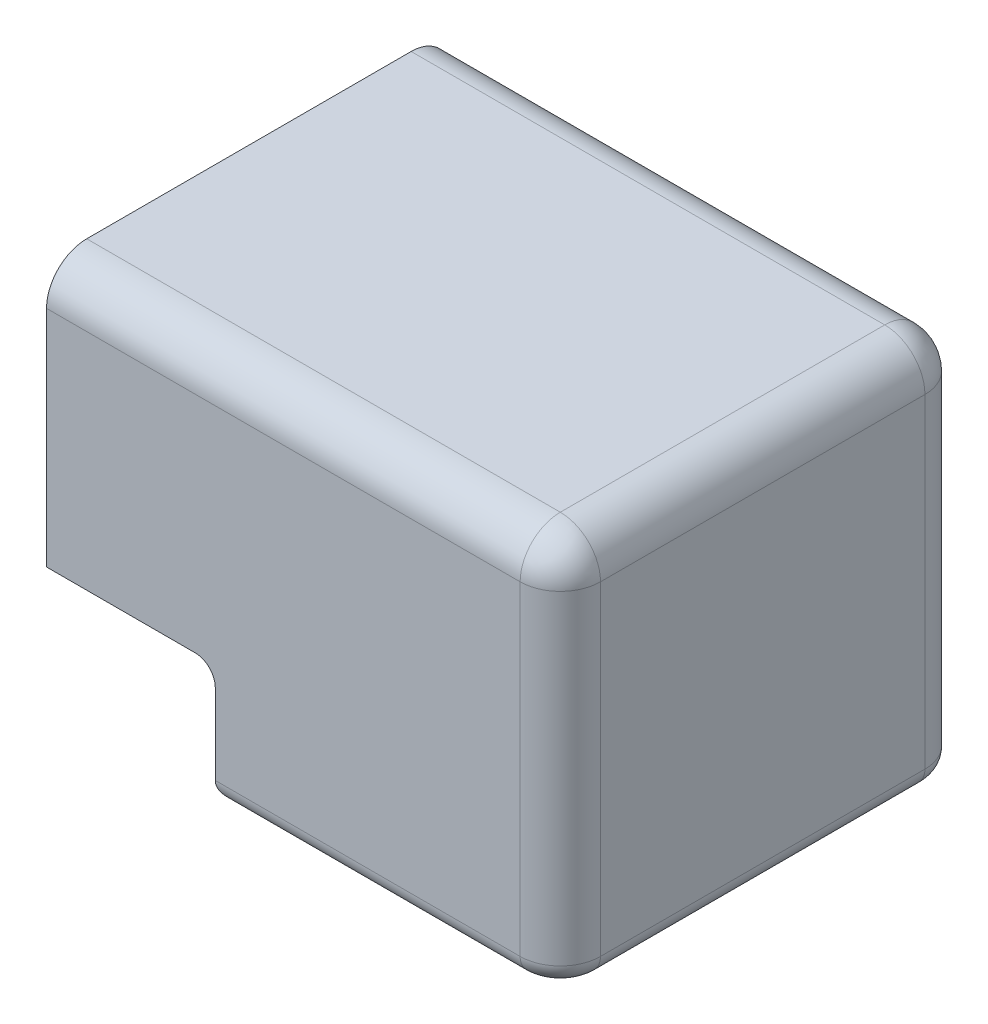
ISO-10303-21;
HEADER;
FILE_DESCRIPTION(('STEP AP214'),'2;1');
FILE_NAME('part.step','',(''),(''),'','','');
FILE_SCHEMA(('AUTOMOTIVE_DESIGN { 1 0 10303 214 1 1 1 1 }'));
ENDSEC;
DATA;
#1=APPLICATION_CONTEXT('core data for automotive mechanical design processes');
#2=APPLICATION_PROTOCOL_DEFINITION('international standard','automotive_design',2000,#1);
#3=PRODUCT_CONTEXT('',#1,'mechanical');
#4=PRODUCT('Part','Part','',(#3));
#5=PRODUCT_RELATED_PRODUCT_CATEGORY('part','',(#4));
#6=PRODUCT_DEFINITION_FORMATION('','',#4);
#7=PRODUCT_DEFINITION_CONTEXT('part definition',#1,'design');
#8=PRODUCT_DEFINITION('design','',#6,#7);
#9=PRODUCT_DEFINITION_SHAPE('','',#8);
#10=(LENGTH_UNIT() NAMED_UNIT(*) SI_UNIT(.MILLI.,.METRE.));
#11=(NAMED_UNIT(*) PLANE_ANGLE_UNIT() SI_UNIT($,.RADIAN.));
#12=(NAMED_UNIT(*) SI_UNIT($,.STERADIAN.) SOLID_ANGLE_UNIT());
#13=UNCERTAINTY_MEASURE_WITH_UNIT(LENGTH_MEASURE(1.E-05),#10,'distance_accuracy_value','');
#14=(GEOMETRIC_REPRESENTATION_CONTEXT(3) GLOBAL_UNCERTAINTY_ASSIGNED_CONTEXT((#13)) GLOBAL_UNIT_ASSIGNED_CONTEXT((#10,
#11,#12)) REPRESENTATION_CONTEXT('',''));
#15=CARTESIAN_POINT('',(0.,0.,0.));
#16=DIRECTION('',(0.,0.,1.));
#17=DIRECTION('',(1.,0.,0.));
#18=AXIS2_PLACEMENT_3D('',#15,#16,#17);
#19=CARTESIAN_POINT('',(76.2,-20.8749999999833,0.));
#20=DIRECTION('',(0.,1.,0.));
#21=DIRECTION('',(0.,0.,1.));
#22=AXIS2_PLACEMENT_3D('',#19,#20,#21);
#23=PLANE('',#22);
#24=DIRECTION('',(-1.,0.,0.));
#25=VECTOR('',#24,1.);
#26=CARTESIAN_POINT('',(76.2,-20.8749999999833,-138.842163617286));
#27=LINE('',#26,#25);
#28=CARTESIAN_POINT('',(23.495,-20.8749999999833,-138.842163617286));
#29=VERTEX_POINT('',#28);
#30=CARTESIAN_POINT('',(0.,-20.8749999999833,-138.842163617286));
#31=VERTEX_POINT('',#30);
#32=EDGE_CURVE('E256',#29,#31,#27,.T.);
#33=ORIENTED_EDGE('',*,*,#32,.F.);
#34=DIRECTION('',(0.,0.,1.));
#35=VECTOR('',#34,1.);
#36=CARTESIAN_POINT('',(23.495,-20.8749999999833,0.));
#37=LINE('',#36,#35);
#38=CARTESIAN_POINT('',(23.495,-20.8749999999833,-74.8671636172858));
#39=VERTEX_POINT('',#38);
#40=EDGE_CURVE('E311',#29,#39,#37,.T.);
#41=ORIENTED_EDGE('',*,*,#40,.T.);
#42=DIRECTION('',(-1.,0.,0.));
#43=VECTOR('',#42,1.);
#44=CARTESIAN_POINT('',(76.2,-20.8749999999833,-74.8671636172858));
#45=LINE('',#44,#43);
#46=CARTESIAN_POINT('',(0.,-20.8749999999833,-74.8671636172858));
#47=VERTEX_POINT('',#46);
#48=EDGE_CURVE('E259',#39,#47,#45,.T.);
#49=ORIENTED_EDGE('',*,*,#48,.T.);
#50=DIRECTION('',(0.,0.,-1.));
#51=VECTOR('',#50,1.);
#52=CARTESIAN_POINT('',(0.,-20.8749999999833,0.));
#53=LINE('',#52,#51);
#54=EDGE_CURVE('E255',#47,#31,#53,.T.);
#55=ORIENTED_EDGE('',*,*,#54,.T.);
#56=EDGE_LOOP('',(#33,#41,#49,#55));
#57=FACE_BOUND('',#56,.T.);
#58=ADVANCED_FACE('F40',(#57),#23,.F.);
#59=CARTESIAN_POINT('',(76.2,0.,-138.842163617286));
#60=DIRECTION('',(0.,0.,1.));
#61=DIRECTION('',(1.,0.,0.));
#62=AXIS2_PLACEMENT_3D('',#59,#60,#61);
#63=PLANE('',#62);
#64=DIRECTION('',(0.,1.,0.));
#65=VECTOR('',#64,1.);
#66=CARTESIAN_POINT('',(74.85,-20.8749999999833,-138.842163617286));
#67=LINE('',#66,#65);
#68=CARTESIAN_POINT('',(74.85,14.5250000000167,-138.842163617286));
#69=VERTEX_POINT('',#68);
#70=CARTESIAN_POINT('',(74.85,-36.7499999999833,-138.842163617286));
#71=VERTEX_POINT('',#70);
#72=EDGE_CURVE('E295',#69,#71,#67,.F.);
#73=ORIENTED_EDGE('',*,*,#72,.T.);
#74=DIRECTION('',(1.,0.,0.));
#75=VECTOR('',#74,1.);
#76=CARTESIAN_POINT('',(26.67,-36.7499999999833,-138.842163617286));
#77=LINE('',#76,#75);
#78=CARTESIAN_POINT('',(26.67,-36.7499999999833,-138.842163617286));
#79=VERTEX_POINT('',#78);
#80=EDGE_CURVE('E349',#71,#79,#77,.F.);
#81=ORIENTED_EDGE('',*,*,#80,.T.);
#82=DIRECTION('',(0.,1.,0.));
#83=VECTOR('',#82,1.);
#84=CARTESIAN_POINT('',(26.67,-39.9249999999833,-138.842163617286));
#85=LINE('',#84,#83);
#86=CARTESIAN_POINT('',(26.67,-24.0499999999833,-138.842163617286));
#87=VERTEX_POINT('',#86);
#88=EDGE_CURVE('E220',#79,#87,#85,.T.);
#89=ORIENTED_EDGE('',*,*,#88,.T.);
#90=CARTESIAN_POINT('',(23.495,-24.0499999999833,-138.842163617286));
#91=DIRECTION('',(0.,0.,1.));
#92=DIRECTION('',(1.,0.,0.));
#93=AXIS2_PLACEMENT_3D('',#90,#91,#92);
#94=CIRCLE('',#93,3.175);
#95=EDGE_CURVE('E334',#87,#29,#94,.T.);
#96=ORIENTED_EDGE('',*,*,#95,.T.);
#97=ORIENTED_EDGE('',*,*,#32,.T.);
#98=DIRECTION('',(0.,1.,0.));
#99=VECTOR('',#98,1.);
#100=CARTESIAN_POINT('',(0.,0.,-138.842163617286));
#101=LINE('',#100,#99);
#102=CARTESIAN_POINT('',(0.,14.5250000000167,-138.842163617286));
#103=VERTEX_POINT('',#102);
#104=EDGE_CURVE('E264',#31,#103,#101,.T.);
#105=ORIENTED_EDGE('',*,*,#104,.T.);
#106=DIRECTION('',(-1.,0.,0.));
#107=VECTOR('',#106,1.);
#108=CARTESIAN_POINT('',(81.2,14.5250000000167,-138.842163617286));
#109=LINE('',#108,#107);
#110=EDGE_CURVE('E293',#103,#69,#109,.F.);
#111=ORIENTED_EDGE('',*,*,#110,.T.);
#112=EDGE_LOOP('',(#73,#81,#89,#96,#97,#105,#111));
#113=FACE_BOUND('',#112,.T.);
#114=ADVANCED_FACE('F421',(#113),#63,.F.);
#115=CARTESIAN_POINT('',(76.2,20.8750000000167,0.));
#116=DIRECTION('',(0.,1.,0.));
#117=DIRECTION('',(0.,0.,1.));
#118=AXIS2_PLACEMENT_3D('',#115,#116,#117);
#119=PLANE('',#118);
#120=DIRECTION('',(0.,0.,-1.));
#121=VECTOR('',#120,1.);
#122=CARTESIAN_POINT('',(74.85,20.8750000000167,0.));
#123=LINE('',#122,#121);
#124=CARTESIAN_POINT('',(74.85,20.8750000000167,-81.2171636172858));
#125=VERTEX_POINT('',#124);
#126=CARTESIAN_POINT('',(74.85,20.8750000000167,-132.492163617286));
#127=VERTEX_POINT('',#126);
#128=EDGE_CURVE('E304',#125,#127,#123,.T.);
#129=ORIENTED_EDGE('',*,*,#128,.T.);
#130=DIRECTION('',(-1.,0.,0.));
#131=VECTOR('',#130,1.);
#132=CARTESIAN_POINT('',(0.,20.8750000000167,-132.492163617286));
#133=LINE('',#132,#131);
#134=CARTESIAN_POINT('',(0.,20.8750000000167,-132.492163617286));
#135=VERTEX_POINT('',#134);
#136=EDGE_CURVE('E306',#127,#135,#133,.T.);
#137=ORIENTED_EDGE('',*,*,#136,.T.);
#138=DIRECTION('',(0.,0.,-1.));
#139=VECTOR('',#138,1.);
#140=CARTESIAN_POINT('',(0.,20.8750000000167,0.));
#141=LINE('',#140,#139);
#142=CARTESIAN_POINT('',(0.,20.8750000000167,-81.2171636172858));
#143=VERTEX_POINT('',#142);
#144=EDGE_CURVE('E267',#143,#135,#141,.T.);
#145=ORIENTED_EDGE('',*,*,#144,.F.);
#146=DIRECTION('',(-1.,0.,0.));
#147=VECTOR('',#146,1.);
#148=CARTESIAN_POINT('',(76.2,20.8750000000167,-81.2171636172858));
#149=LINE('',#148,#147);
#150=EDGE_CURVE('E302',#143,#125,#149,.F.);
#151=ORIENTED_EDGE('',*,*,#150,.T.);
#152=EDGE_LOOP('',(#129,#137,#145,#151));
#153=FACE_BOUND('',#152,.T.);
#154=ADVANCED_FACE('F452',(#153),#119,.T.);
#155=CARTESIAN_POINT('',(76.2,0.,-74.8671636172858));
#156=DIRECTION('',(0.,0.,1.));
#157=DIRECTION('',(1.,0.,0.));
#158=AXIS2_PLACEMENT_3D('',#155,#156,#157);
#159=PLANE('',#158);
#160=DIRECTION('',(0.,1.,0.));
#161=VECTOR('',#160,1.);
#162=CARTESIAN_POINT('',(26.67,-39.9249999999833,-74.8671636172858));
#163=LINE('',#162,#161);
#164=CARTESIAN_POINT('',(26.67,-36.7499999999833,-74.8671636172858));
#165=VERTEX_POINT('',#164);
#166=CARTESIAN_POINT('',(26.67,-24.0499999999833,-74.8671636172858));
#167=VERTEX_POINT('',#166);
#168=EDGE_CURVE('E224',#165,#167,#163,.T.);
#169=ORIENTED_EDGE('',*,*,#168,.F.);
#170=DIRECTION('',(-1.,0.,0.));
#171=VECTOR('',#170,1.);
#172=CARTESIAN_POINT('',(76.2,-36.7499999999833,-74.8671636172858));
#173=LINE('',#172,#171);
#174=CARTESIAN_POINT('',(74.85,-36.7499999999833,-74.8671636172858));
#175=VERTEX_POINT('',#174);
#176=EDGE_CURVE('E11',#165,#175,#173,.F.);
#177=ORIENTED_EDGE('',*,*,#176,.T.);
#178=DIRECTION('',(0.,1.,0.));
#179=VECTOR('',#178,1.);
#180=CARTESIAN_POINT('',(74.85,0.,-74.8671636172858));
#181=LINE('',#180,#179);
#182=CARTESIAN_POINT('',(74.85,14.5250000000167,-74.8671636172858));
#183=VERTEX_POINT('',#182);
#184=EDGE_CURVE('E300',#175,#183,#181,.T.);
#185=ORIENTED_EDGE('',*,*,#184,.T.);
#186=DIRECTION('',(-1.,0.,0.));
#187=VECTOR('',#186,1.);
#188=CARTESIAN_POINT('',(76.2,14.5250000000167,-74.8671636172858));
#189=LINE('',#188,#187);
#190=CARTESIAN_POINT('',(0.,14.5250000000167,-74.8671636172858));
#191=VERTEX_POINT('',#190);
#192=EDGE_CURVE('E298',#183,#191,#189,.T.);
#193=ORIENTED_EDGE('',*,*,#192,.T.);
#194=DIRECTION('',(0.,1.,0.));
#195=VECTOR('',#194,1.);
#196=CARTESIAN_POINT('',(0.,0.,-74.8671636172858));
#197=LINE('',#196,#195);
#198=EDGE_CURVE('E261',#47,#191,#197,.T.);
#199=ORIENTED_EDGE('',*,*,#198,.F.);
#200=ORIENTED_EDGE('',*,*,#48,.F.);
#201=CARTESIAN_POINT('',(23.495,-24.0499999999833,-74.8671636172858));
#202=DIRECTION('',(0.,0.,1.));
#203=DIRECTION('',(1.,0.,0.));
#204=AXIS2_PLACEMENT_3D('',#201,#202,#203);
#205=CIRCLE('',#204,3.175);
#206=EDGE_CURVE('E331',#39,#167,#205,.F.);
#207=ORIENTED_EDGE('',*,*,#206,.T.);
#208=EDGE_LOOP('',(#169,#177,#185,#193,#199,#200,#207));
#209=FACE_BOUND('',#208,.T.);
#210=ADVANCED_FACE('F405',(#209),#159,.T.);
#211=CARTESIAN_POINT('',(81.2,0.,0.));
#212=DIRECTION('',(1.,0.,0.));
#213=DIRECTION('',(0.,0.,-1.));
#214=AXIS2_PLACEMENT_3D('',#211,#212,#213);
#215=PLANE('',#214);
#216=DIRECTION('',(0.,1.,0.));
#217=VECTOR('',#216,1.);
#218=CARTESIAN_POINT('',(81.2,0.,-81.2171636172858));
#219=LINE('',#218,#217);
#220=CARTESIAN_POINT('',(81.2,14.5250000000167,-81.2171636172858));
#221=VERTEX_POINT('',#220);
#222=CARTESIAN_POINT('',(81.2,-36.7499999999833,-81.2171636172858));
#223=VERTEX_POINT('',#222);
#224=EDGE_CURVE('E288',#221,#223,#219,.F.);
#225=ORIENTED_EDGE('',*,*,#224,.T.);
#226=DIRECTION('',(0.,0.,1.));
#227=VECTOR('',#226,1.);
#228=CARTESIAN_POINT('',(81.2,-36.7499999999833,0.));
#229=LINE('',#228,#227);
#230=CARTESIAN_POINT('',(81.2,-36.7499999999833,-132.492163617286));
#231=VERTEX_POINT('',#230);
#232=EDGE_CURVE('E354',#223,#231,#229,.F.);
#233=ORIENTED_EDGE('',*,*,#232,.T.);
#234=DIRECTION('',(0.,1.,0.));
#235=VECTOR('',#234,1.);
#236=CARTESIAN_POINT('',(81.2,20.8750000000167,-132.492163617286));
#237=LINE('',#236,#235);
#238=CARTESIAN_POINT('',(81.2,14.5250000000167,-132.492163617286));
#239=VERTEX_POINT('',#238);
#240=EDGE_CURVE('E291',#231,#239,#237,.T.);
#241=ORIENTED_EDGE('',*,*,#240,.T.);
#242=DIRECTION('',(0.,0.,-1.));
#243=VECTOR('',#242,1.);
#244=CARTESIAN_POINT('',(81.2,14.5250000000167,0.));
#245=LINE('',#244,#243);
#246=EDGE_CURVE('E286',#239,#221,#245,.F.);
#247=ORIENTED_EDGE('',*,*,#246,.T.);
#248=EDGE_LOOP('',(#225,#233,#241,#247));
#249=FACE_BOUND('',#248,.T.);
#250=ADVANCED_FACE('F388',(#249),#215,.T.);
#251=CARTESIAN_POINT('',(0.,0.,0.));
#252=DIRECTION('',(1.,0.,0.));
#253=DIRECTION('',(0.,0.,-1.));
#254=AXIS2_PLACEMENT_3D('',#251,#252,#253);
#255=PLANE('',#254);
#256=DIRECTION('',(0.,1.,0.));
#257=VECTOR('',#256,1.);
#258=CARTESIAN_POINT('',(0.,0.,-79.8671636172858));
#259=LINE('',#258,#257);
#260=CARTESIAN_POINT('',(0.,-15.8749999999833,-79.8671636172858));
#261=VERTEX_POINT('',#260);
#262=CARTESIAN_POINT('',(0.,15.8750000000167,-79.8671636172858));
#263=VERTEX_POINT('',#262);
#264=EDGE_CURVE('E234',#261,#263,#259,.T.);
#265=ORIENTED_EDGE('',*,*,#264,.F.);
#266=DIRECTION('',(0.,0.,-1.));
#267=VECTOR('',#266,1.);
#268=CARTESIAN_POINT('',(0.,-15.8749999999833,0.));
#269=LINE('',#268,#267);
#270=CARTESIAN_POINT('',(0.,-15.8749999999833,-133.842163617286));
#271=VERTEX_POINT('',#270);
#272=EDGE_CURVE('E229',#261,#271,#269,.T.);
#273=ORIENTED_EDGE('',*,*,#272,.T.);
#274=DIRECTION('',(0.,1.,0.));
#275=VECTOR('',#274,1.);
#276=CARTESIAN_POINT('',(0.,0.,-133.842163617286));
#277=LINE('',#276,#275);
#278=CARTESIAN_POINT('',(0.,15.8750000000167,-133.842163617286));
#279=VERTEX_POINT('',#278);
#280=EDGE_CURVE('E240',#271,#279,#277,.T.);
#281=ORIENTED_EDGE('',*,*,#280,.T.);
#282=DIRECTION('',(0.,0.,-1.));
#283=VECTOR('',#282,1.);
#284=CARTESIAN_POINT('',(0.,15.8750000000167,0.));
#285=LINE('',#284,#283);
#286=EDGE_CURVE('E243',#263,#279,#285,.T.);
#287=ORIENTED_EDGE('',*,*,#286,.F.);
#288=EDGE_LOOP('',(#265,#273,#281,#287));
#289=FACE_BOUND('',#288,.T.);
#290=ORIENTED_EDGE('',*,*,#144,.T.);
#291=CARTESIAN_POINT('',(0.,14.5250000000167,-132.492163617286));
#292=DIRECTION('',(1.,0.,0.));
#293=DIRECTION('',(0.,0.,-1.));
#294=AXIS2_PLACEMENT_3D('',#291,#292,#293);
#295=CIRCLE('',#294,6.35);
#296=EDGE_CURVE('E310',#135,#103,#295,.F.);
#297=ORIENTED_EDGE('',*,*,#296,.T.);
#298=ORIENTED_EDGE('',*,*,#104,.F.);
#299=ORIENTED_EDGE('',*,*,#54,.F.);
#300=ORIENTED_EDGE('',*,*,#198,.T.);
#301=CARTESIAN_POINT('',(0.,14.5250000000167,-81.2171636172858));
#302=DIRECTION('',(1.,0.,0.));
#303=DIRECTION('',(0.,0.,-1.));
#304=AXIS2_PLACEMENT_3D('',#301,#302,#303);
#305=CIRCLE('',#304,6.35);
#306=EDGE_CURVE('E308',#191,#143,#305,.F.);
#307=ORIENTED_EDGE('',*,*,#306,.T.);
#308=EDGE_LOOP('',(#290,#297,#298,#299,#300,#307));
#309=FACE_BOUND('',#308,.T.);
#310=ADVANCED_FACE('F409',(#289,#309),#255,.F.);
#311=CARTESIAN_POINT('',(76.2,-15.8749999999833,0.));
#312=DIRECTION('',(0.,1.,0.));
#313=DIRECTION('',(0.,0.,1.));
#314=AXIS2_PLACEMENT_3D('',#311,#312,#313);
#315=PLANE('',#314);
#316=DIRECTION('',(-1.,0.,0.));
#317=VECTOR('',#316,1.);
#318=CARTESIAN_POINT('',(76.2,-15.8749999999833,-79.8671636172858));
#319=LINE('',#318,#317);
#320=CARTESIAN_POINT('',(25.5451631770046,-15.8749999999833,-79.8671636172858));
#321=VERTEX_POINT('',#320);
#322=EDGE_CURVE('E237',#321,#261,#319,.T.);
#323=ORIENTED_EDGE('',*,*,#322,.F.);
#324=DIRECTION('',(0.,0.,1.));
#325=VECTOR('',#324,1.);
#326=CARTESIAN_POINT('',(25.5451631770046,-15.8749999999833,-133.842163617286));
#327=LINE('',#326,#325);
#328=CARTESIAN_POINT('',(25.5451631770046,-15.8749999999833,-133.842163617286));
#329=VERTEX_POINT('',#328);
#330=EDGE_CURVE('E280',#321,#329,#327,.F.);
#331=ORIENTED_EDGE('',*,*,#330,.T.);
#332=DIRECTION('',(-1.,0.,0.));
#333=VECTOR('',#332,1.);
#334=CARTESIAN_POINT('',(76.2,-15.8749999999833,-133.842163617286));
#335=LINE('',#334,#333);
#336=EDGE_CURVE('E253',#329,#271,#335,.T.);
#337=ORIENTED_EDGE('',*,*,#336,.T.);
#338=ORIENTED_EDGE('',*,*,#272,.F.);
#339=EDGE_LOOP('',(#323,#331,#337,#338));
#340=FACE_BOUND('',#339,.T.);
#341=ADVANCED_FACE('F642',(#340),#315,.T.);
#342=CARTESIAN_POINT('',(76.2,0.,-133.842163617286));
#343=DIRECTION('',(0.,0.,1.));
#344=DIRECTION('',(1.,0.,0.));
#345=AXIS2_PLACEMENT_3D('',#342,#343,#344);
#346=PLANE('',#345);
#347=DIRECTION('',(0.,1.,0.));
#348=VECTOR('',#347,1.);
#349=CARTESIAN_POINT('',(76.2,0.,-133.842163617286));
#350=LINE('',#349,#348);
#351=CARTESIAN_POINT('',(76.2,-39.9249999999833,-133.842163617286));
#352=VERTEX_POINT('',#351);
#353=CARTESIAN_POINT('',(76.2,-15.8749999999833,-133.842163617286));
#354=VERTEX_POINT('',#353);
#355=EDGE_CURVE('E231',#352,#354,#350,.T.);
#356=ORIENTED_EDGE('',*,*,#355,.T.);
#357=CARTESIAN_POINT('',(44.45,-15.8749999999833,-133.842163617286));
#358=DIRECTION('',(0.,0.,1.));
#359=DIRECTION('',(1.,0.,0.));
#360=AXIS2_PLACEMENT_3D('',#357,#358,#359);
#361=CIRCLE('',#360,31.75);
#362=CARTESIAN_POINT('',(44.45,15.8750000000167,-133.842163617286));
#363=VERTEX_POINT('',#362);
#364=EDGE_CURVE('E274',#354,#363,#361,.T.);
#365=ORIENTED_EDGE('',*,*,#364,.T.);
#366=DIRECTION('',(-1.,0.,0.));
#367=VECTOR('',#366,1.);
#368=CARTESIAN_POINT('',(76.2,15.8750000000167,-133.842163617286));
#369=LINE('',#368,#367);
#370=EDGE_CURVE('E251',#363,#279,#369,.T.);
#371=ORIENTED_EDGE('',*,*,#370,.T.);
#372=ORIENTED_EDGE('',*,*,#280,.F.);
#373=ORIENTED_EDGE('',*,*,#336,.F.);
#374=CARTESIAN_POINT('',(25.5451631770046,-22.2249999999833,-133.842163617286));
#375=DIRECTION('',(0.,0.,1.));
#376=DIRECTION('',(1.,0.,0.));
#377=AXIS2_PLACEMENT_3D('',#374,#375,#376);
#378=CIRCLE('',#377,6.35);
#379=CARTESIAN_POINT('',(31.75,-20.8749999999833,-133.842163617286));
#380=VERTEX_POINT('',#379);
#381=EDGE_CURVE('E214',#329,#380,#378,.F.);
#382=ORIENTED_EDGE('',*,*,#381,.T.);
#383=DIRECTION('',(0.,1.,0.));
#384=VECTOR('',#383,1.);
#385=CARTESIAN_POINT('',(31.75,-39.9249999999833,-133.842163617286));
#386=LINE('',#385,#384);
#387=CARTESIAN_POINT('',(31.75,-39.9249999999833,-133.842163617286));
#388=VERTEX_POINT('',#387);
#389=EDGE_CURVE('E194',#388,#380,#386,.T.);
#390=ORIENTED_EDGE('',*,*,#389,.F.);
#391=DIRECTION('',(-1.,0.,0.));
#392=VECTOR('',#391,1.);
#393=CARTESIAN_POINT('',(0.,-39.9249999999833,-133.842163617286));
#394=LINE('',#393,#392);
#395=EDGE_CURVE('E201',#352,#388,#394,.T.);
#396=ORIENTED_EDGE('',*,*,#395,.F.);
#397=EDGE_LOOP('',(#356,#365,#371,#372,#373,#382,#390,#396));
#398=FACE_BOUND('',#397,.T.);
#399=ADVANCED_FACE('F212',(#398),#346,.T.);
#400=CARTESIAN_POINT('',(76.2,15.8750000000167,0.));
#401=DIRECTION('',(0.,1.,0.));
#402=DIRECTION('',(0.,0.,1.));
#403=AXIS2_PLACEMENT_3D('',#400,#401,#402);
#404=PLANE('',#403);
#405=ORIENTED_EDGE('',*,*,#370,.F.);
#406=DIRECTION('',(0.,0.,-1.));
#407=VECTOR('',#406,1.);
#408=CARTESIAN_POINT('',(44.45,15.8750000000167,-79.8671636172858));
#409=LINE('',#408,#407);
#410=CARTESIAN_POINT('',(44.45,15.8750000000167,-79.8671636172858));
#411=VERTEX_POINT('',#410);
#412=EDGE_CURVE('E276',#363,#411,#409,.F.);
#413=ORIENTED_EDGE('',*,*,#412,.T.);
#414=DIRECTION('',(-1.,0.,0.));
#415=VECTOR('',#414,1.);
#416=CARTESIAN_POINT('',(76.2,15.8750000000167,-79.8671636172858));
#417=LINE('',#416,#415);
#418=EDGE_CURVE('E249',#411,#263,#417,.T.);
#419=ORIENTED_EDGE('',*,*,#418,.T.);
#420=ORIENTED_EDGE('',*,*,#286,.T.);
#421=EDGE_LOOP('',(#405,#413,#419,#420));
#422=FACE_BOUND('',#421,.T.);
#423=ADVANCED_FACE('F630',(#422),#404,.F.);
#424=CARTESIAN_POINT('',(76.2,0.,-79.8671636172858));
#425=DIRECTION('',(0.,0.,1.));
#426=DIRECTION('',(1.,0.,0.));
#427=AXIS2_PLACEMENT_3D('',#424,#425,#426);
#428=PLANE('',#427);
#429=ORIENTED_EDGE('',*,*,#418,.F.);
#430=CARTESIAN_POINT('',(44.45,-15.8749999999833,-79.8671636172858));
#431=DIRECTION('',(0.,0.,1.));
#432=DIRECTION('',(1.,0.,0.));
#433=AXIS2_PLACEMENT_3D('',#430,#431,#432);
#434=CIRCLE('',#433,31.75);
#435=CARTESIAN_POINT('',(76.2,-15.8749999999833,-79.8671636172858));
#436=VERTEX_POINT('',#435);
#437=EDGE_CURVE('E278',#411,#436,#434,.F.);
#438=ORIENTED_EDGE('',*,*,#437,.T.);
#439=DIRECTION('',(0.,1.,0.));
#440=VECTOR('',#439,1.);
#441=CARTESIAN_POINT('',(76.2,0.,-79.8671636172858));
#442=LINE('',#441,#440);
#443=CARTESIAN_POINT('',(76.2,-39.9249999999833,-79.8671636172858));
#444=VERTEX_POINT('',#443);
#445=EDGE_CURVE('E233',#444,#436,#442,.T.);
#446=ORIENTED_EDGE('',*,*,#445,.F.);
#447=DIRECTION('',(1.,0.,0.));
#448=VECTOR('',#447,1.);
#449=CARTESIAN_POINT('',(0.,-39.9249999999833,-79.8671636172858));
#450=LINE('',#449,#448);
#451=CARTESIAN_POINT('',(31.75,-39.9249999999833,-79.8671636172858));
#452=VERTEX_POINT('',#451);
#453=EDGE_CURVE('E200',#452,#444,#450,.T.);
#454=ORIENTED_EDGE('',*,*,#453,.F.);
#455=DIRECTION('',(0.,1.,0.));
#456=VECTOR('',#455,1.);
#457=CARTESIAN_POINT('',(31.75,-39.9249999999833,-79.8671636172858));
#458=LINE('',#457,#456);
#459=CARTESIAN_POINT('',(31.75,-20.8749999999833,-79.8671636172858));
#460=VERTEX_POINT('',#459);
#461=EDGE_CURVE('E196',#452,#460,#458,.T.);
#462=ORIENTED_EDGE('',*,*,#461,.T.);
#463=CARTESIAN_POINT('',(25.5451631770046,-22.2249999999833,-79.8671636172858));
#464=DIRECTION('',(0.,0.,1.));
#465=DIRECTION('',(1.,0.,0.));
#466=AXIS2_PLACEMENT_3D('',#463,#464,#465);
#467=CIRCLE('',#466,6.35);
#468=EDGE_CURVE('E284',#460,#321,#467,.T.);
#469=ORIENTED_EDGE('',*,*,#468,.T.);
#470=ORIENTED_EDGE('',*,*,#322,.T.);
#471=ORIENTED_EDGE('',*,*,#264,.T.);
#472=EDGE_LOOP('',(#429,#438,#446,#454,#462,#469,#470,#471));
#473=FACE_BOUND('',#472,.T.);
#474=ADVANCED_FACE('F619',(#473),#428,.F.);
#475=CARTESIAN_POINT('',(76.2,0.,0.));
#476=DIRECTION('',(1.,0.,0.));
#477=DIRECTION('',(0.,0.,-1.));
#478=AXIS2_PLACEMENT_3D('',#475,#476,#477);
#479=PLANE('',#478);
#480=ORIENTED_EDGE('',*,*,#445,.T.);
#481=DIRECTION('',(0.,0.,-1.));
#482=VECTOR('',#481,1.);
#483=CARTESIAN_POINT('',(76.2,-15.8749999999833,-133.842163617286));
#484=LINE('',#483,#482);
#485=EDGE_CURVE('E258',#436,#354,#484,.T.);
#486=ORIENTED_EDGE('',*,*,#485,.T.);
#487=ORIENTED_EDGE('',*,*,#355,.F.);
#488=DIRECTION('',(0.,0.,-1.));
#489=VECTOR('',#488,1.);
#490=CARTESIAN_POINT('',(76.2,-39.9249999999833,0.));
#491=LINE('',#490,#489);
#492=EDGE_CURVE('E207',#444,#352,#491,.T.);
#493=ORIENTED_EDGE('',*,*,#492,.F.);
#494=EDGE_LOOP('',(#480,#486,#487,#493));
#495=FACE_BOUND('',#494,.T.);
#496=ADVANCED_FACE('F468',(#495),#479,.F.);
#497=CARTESIAN_POINT('',(44.45,-15.8749999999833,0.));
#498=DIRECTION('',(0.,0.,1.));
#499=DIRECTION('',(1.,0.,0.));
#500=AXIS2_PLACEMENT_3D('',#497,#498,#499);
#501=CYLINDRICAL_SURFACE('',#500,31.75);
#502=ORIENTED_EDGE('',*,*,#437,.F.);
#503=ORIENTED_EDGE('',*,*,#412,.F.);
#504=ORIENTED_EDGE('',*,*,#364,.F.);
#505=ORIENTED_EDGE('',*,*,#485,.F.);
#506=EDGE_LOOP('',(#502,#503,#504,#505));
#507=FACE_BOUND('',#506,.T.);
#508=ADVANCED_FACE('F464',(#507),#501,.F.);
#509=CARTESIAN_POINT('',(25.5451631770046,-22.2249999999833,0.));
#510=DIRECTION('',(0.,0.,-1.));
#511=DIRECTION('',(-1.,0.,0.));
#512=AXIS2_PLACEMENT_3D('',#509,#510,#511);
#513=CYLINDRICAL_SURFACE('',#512,6.35);
#514=ORIENTED_EDGE('',*,*,#468,.F.);
#515=DIRECTION('',(0.,0.,-1.));
#516=VECTOR('',#515,1.);
#517=CARTESIAN_POINT('',(31.75,-20.8749999999833,0.));
#518=LINE('',#517,#516);
#519=EDGE_CURVE('E227',#460,#380,#518,.T.);
#520=ORIENTED_EDGE('',*,*,#519,.T.);
#521=ORIENTED_EDGE('',*,*,#381,.F.);
#522=ORIENTED_EDGE('',*,*,#330,.F.);
#523=EDGE_LOOP('',(#514,#520,#521,#522));
#524=FACE_BOUND('',#523,.T.);
#525=ADVANCED_FACE('F467',(#524),#513,.T.);
#526=CARTESIAN_POINT('',(74.85,0.,-81.2171636172858));
#527=DIRECTION('',(0.,1.,0.));
#528=DIRECTION('',(0.,0.,1.));
#529=AXIS2_PLACEMENT_3D('',#526,#527,#528);
#530=CYLINDRICAL_SURFACE('',#529,6.35);
#531=ORIENTED_EDGE('',*,*,#184,.F.);
#532=CARTESIAN_POINT('',(74.85,-36.7499999999833,-81.2171636172858));
#533=DIRECTION('',(0.,-1.,0.));
#534=DIRECTION('',(0.,0.,-1.));
#535=AXIS2_PLACEMENT_3D('',#532,#533,#534);
#536=CIRCLE('',#535,6.35);
#537=EDGE_CURVE('E356',#175,#223,#536,.F.);
#538=ORIENTED_EDGE('',*,*,#537,.T.);
#539=ORIENTED_EDGE('',*,*,#224,.F.);
#540=CARTESIAN_POINT('',(74.85,14.5250000000167,-81.2171636172858));
#541=DIRECTION('',(0.,1.,0.));
#542=DIRECTION('',(0.,0.,1.));
#543=AXIS2_PLACEMENT_3D('',#540,#541,#542);
#544=CIRCLE('',#543,6.35);
#545=EDGE_CURVE('E230',#183,#221,#544,.T.);
#546=ORIENTED_EDGE('',*,*,#545,.F.);
#547=EDGE_LOOP('',(#531,#538,#539,#546));
#548=FACE_BOUND('',#547,.T.);
#549=ADVANCED_FACE('F385',(#548),#530,.T.);
#550=CARTESIAN_POINT('',(76.2,14.5250000000167,-81.2171636172858));
#551=DIRECTION('',(-1.,0.,0.));
#552=DIRECTION('',(0.,0.,1.));
#553=AXIS2_PLACEMENT_3D('',#550,#551,#552);
#554=CYLINDRICAL_SURFACE('',#553,6.35);
#555=ORIENTED_EDGE('',*,*,#306,.F.);
#556=ORIENTED_EDGE('',*,*,#192,.F.);
#557=CARTESIAN_POINT('',(74.85,14.5250000000167,-81.2171636172858));
#558=DIRECTION('',(1.,0.,0.));
#559=DIRECTION('',(0.,0.,-1.));
#560=AXIS2_PLACEMENT_3D('',#557,#558,#559);
#561=CIRCLE('',#560,6.35);
#562=EDGE_CURVE('E321',#125,#183,#561,.T.);
#563=ORIENTED_EDGE('',*,*,#562,.F.);
#564=ORIENTED_EDGE('',*,*,#150,.F.);
#565=EDGE_LOOP('',(#555,#556,#563,#564));
#566=FACE_BOUND('',#565,.T.);
#567=ADVANCED_FACE('F403',(#566),#554,.T.);
#568=CARTESIAN_POINT('',(74.85,14.5250000000167,-81.2171636172858));
#569=DIRECTION('',(0.,0.,1.));
#570=DIRECTION('',(1.,0.,0.));
#571=AXIS2_PLACEMENT_3D('',#568,#569,#570);
#572=SPHERICAL_SURFACE('',#571,6.35);
#573=ORIENTED_EDGE('',*,*,#562,.T.);
#574=ORIENTED_EDGE('',*,*,#545,.T.);
#575=CARTESIAN_POINT('',(74.85,14.5250000000167,-81.2171636172858));
#576=DIRECTION('',(0.,0.,1.));
#577=DIRECTION('',(1.,0.,0.));
#578=AXIS2_PLACEMENT_3D('',#575,#576,#577);
#579=CIRCLE('',#578,6.35);
#580=EDGE_CURVE('E318',#125,#221,#579,.F.);
#581=ORIENTED_EDGE('',*,*,#580,.F.);
#582=EDGE_LOOP('',(#573,#574,#581));
#583=FACE_BOUND('',#582,.T.);
#584=ADVANCED_FACE('F397',(#583),#572,.T.);
#585=CARTESIAN_POINT('',(74.85,14.5250000000167,0.));
#586=DIRECTION('',(0.,0.,-1.));
#587=DIRECTION('',(-1.,0.,0.));
#588=AXIS2_PLACEMENT_3D('',#585,#586,#587);
#589=CYLINDRICAL_SURFACE('',#588,6.35);
#590=ORIENTED_EDGE('',*,*,#580,.T.);
#591=ORIENTED_EDGE('',*,*,#246,.F.);
#592=CARTESIAN_POINT('',(74.85,14.5250000000167,-132.492163617286));
#593=DIRECTION('',(0.,0.,-1.));
#594=DIRECTION('',(-1.,0.,0.));
#595=AXIS2_PLACEMENT_3D('',#592,#593,#594);
#596=CIRCLE('',#595,6.35);
#597=EDGE_CURVE('E315',#127,#239,#596,.T.);
#598=ORIENTED_EDGE('',*,*,#597,.F.);
#599=ORIENTED_EDGE('',*,*,#128,.F.);
#600=EDGE_LOOP('',(#590,#591,#598,#599));
#601=FACE_BOUND('',#600,.T.);
#602=ADVANCED_FACE('F393',(#601),#589,.T.);
#603=CARTESIAN_POINT('',(76.2,14.5250000000167,-132.492163617286));
#604=DIRECTION('',(1.,0.,0.));
#605=DIRECTION('',(0.,0.,-1.));
#606=AXIS2_PLACEMENT_3D('',#603,#604,#605);
#607=CYLINDRICAL_SURFACE('',#606,6.35);
#608=ORIENTED_EDGE('',*,*,#296,.F.);
#609=ORIENTED_EDGE('',*,*,#136,.F.);
#610=CARTESIAN_POINT('',(74.85,14.5250000000167,-132.492163617286));
#611=DIRECTION('',(1.,0.,0.));
#612=DIRECTION('',(0.,0.,-1.));
#613=AXIS2_PLACEMENT_3D('',#610,#611,#612);
#614=CIRCLE('',#613,6.35);
#615=EDGE_CURVE('E218',#69,#127,#614,.T.);
#616=ORIENTED_EDGE('',*,*,#615,.F.);
#617=ORIENTED_EDGE('',*,*,#110,.F.);
#618=EDGE_LOOP('',(#608,#609,#616,#617));
#619=FACE_BOUND('',#618,.T.);
#620=ADVANCED_FACE('F480',(#619),#607,.T.);
#621=CARTESIAN_POINT('',(74.85,14.5250000000167,-132.492163617286));
#622=DIRECTION('',(0.,1.,0.));
#623=DIRECTION('',(0.,0.,1.));
#624=AXIS2_PLACEMENT_3D('',#621,#622,#623);
#625=SPHERICAL_SURFACE('',#624,6.35);
#626=ORIENTED_EDGE('',*,*,#615,.T.);
#627=ORIENTED_EDGE('',*,*,#597,.T.);
#628=CARTESIAN_POINT('',(74.85,14.5250000000167,-132.492163617286));
#629=DIRECTION('',(0.,1.,0.));
#630=DIRECTION('',(0.,0.,1.));
#631=AXIS2_PLACEMENT_3D('',#628,#629,#630);
#632=CIRCLE('',#631,6.35);
#633=EDGE_CURVE('E215',#69,#239,#632,.F.);
#634=ORIENTED_EDGE('',*,*,#633,.F.);
#635=EDGE_LOOP('',(#626,#627,#634));
#636=FACE_BOUND('',#635,.T.);
#637=ADVANCED_FACE('F476',(#636),#625,.T.);
#638=CARTESIAN_POINT('',(74.85,0.,-132.492163617286));
#639=DIRECTION('',(0.,-1.,0.));
#640=DIRECTION('',(0.,0.,-1.));
#641=AXIS2_PLACEMENT_3D('',#638,#639,#640);
#642=CYLINDRICAL_SURFACE('',#641,6.35);
#643=ORIENTED_EDGE('',*,*,#240,.F.);
#644=CARTESIAN_POINT('',(74.85,-36.7499999999833,-132.492163617286));
#645=DIRECTION('',(0.,-1.,0.));
#646=DIRECTION('',(0.,0.,-1.));
#647=AXIS2_PLACEMENT_3D('',#644,#645,#646);
#648=CIRCLE('',#647,6.35);
#649=EDGE_CURVE('E352',#231,#71,#648,.F.);
#650=ORIENTED_EDGE('',*,*,#649,.T.);
#651=ORIENTED_EDGE('',*,*,#72,.F.);
#652=ORIENTED_EDGE('',*,*,#633,.T.);
#653=EDGE_LOOP('',(#643,#650,#651,#652));
#654=FACE_BOUND('',#653,.T.);
#655=ADVANCED_FACE('F473',(#654),#642,.T.);
#656=CARTESIAN_POINT('',(31.75,-39.9249999999833,0.));
#657=DIRECTION('',(-1.,0.,0.));
#658=DIRECTION('',(0.,0.,1.));
#659=AXIS2_PLACEMENT_3D('',#656,#657,#658);
#660=PLANE('',#659);
#661=ORIENTED_EDGE('',*,*,#519,.F.);
#662=ORIENTED_EDGE('',*,*,#461,.F.);
#663=DIRECTION('',(0.,0.,1.));
#664=VECTOR('',#663,1.);
#665=CARTESIAN_POINT('',(31.75,-39.9249999999833,0.));
#666=LINE('',#665,#664);
#667=EDGE_CURVE('E189',#388,#452,#666,.T.);
#668=ORIENTED_EDGE('',*,*,#667,.F.);
#669=ORIENTED_EDGE('',*,*,#389,.T.);
#670=EDGE_LOOP('',(#661,#662,#668,#669));
#671=FACE_BOUND('',#670,.T.);
#672=ADVANCED_FACE('F192',(#671),#660,.F.);
#673=CARTESIAN_POINT('',(26.67,-39.9249999999833,0.));
#674=DIRECTION('',(-1.,0.,0.));
#675=DIRECTION('',(0.,0.,1.));
#676=AXIS2_PLACEMENT_3D('',#673,#674,#675);
#677=PLANE('',#676);
#678=ORIENTED_EDGE('',*,*,#88,.F.);
#679=DIRECTION('',(0.,0.,1.));
#680=VECTOR('',#679,1.);
#681=CARTESIAN_POINT('',(26.67,-36.7499999999833,0.));
#682=LINE('',#681,#680);
#683=EDGE_CURVE('E49',#79,#165,#682,.T.);
#684=ORIENTED_EDGE('',*,*,#683,.T.);
#685=ORIENTED_EDGE('',*,*,#168,.T.);
#686=DIRECTION('',(0.,0.,1.));
#687=VECTOR('',#686,1.);
#688=CARTESIAN_POINT('',(26.67,-24.0499999999833,0.));
#689=LINE('',#688,#687);
#690=EDGE_CURVE('E328',#167,#87,#689,.F.);
#691=ORIENTED_EDGE('',*,*,#690,.T.);
#692=EDGE_LOOP('',(#678,#684,#685,#691));
#693=FACE_BOUND('',#692,.T.);
#694=ADVANCED_FACE('F419',(#693),#677,.T.);
#695=CARTESIAN_POINT('',(0.,-39.9249999999833,0.));
#696=DIRECTION('',(0.,-1.,0.));
#697=DIRECTION('',(0.,0.,-1.));
#698=AXIS2_PLACEMENT_3D('',#695,#696,#697);
#699=PLANE('',#698);
#700=DIRECTION('',(0.,0.,1.));
#701=VECTOR('',#700,1.);
#702=CARTESIAN_POINT('',(29.845,-39.9249999999833,0.));
#703=LINE('',#702,#701);
#704=CARTESIAN_POINT('',(29.845,-39.9249999999833,-78.0421636172858));
#705=VERTEX_POINT('',#704);
#706=CARTESIAN_POINT('',(29.845,-39.9249999999833,-135.667163617286));
#707=VERTEX_POINT('',#706);
#708=EDGE_CURVE('E338',#705,#707,#703,.F.);
#709=ORIENTED_EDGE('',*,*,#708,.T.);
#710=DIRECTION('',(1.,0.,0.));
#711=VECTOR('',#710,1.);
#712=CARTESIAN_POINT('',(74.85,-39.9249999999833,-135.667163617286));
#713=LINE('',#712,#711);
#714=CARTESIAN_POINT('',(74.85,-39.9249999999833,-135.667163617286));
#715=VERTEX_POINT('',#714);
#716=EDGE_CURVE('E346',#707,#715,#713,.T.);
#717=ORIENTED_EDGE('',*,*,#716,.T.);
#718=CARTESIAN_POINT('',(74.85,-39.9249999999833,-132.492163617286));
#719=DIRECTION('',(0.,-1.,0.));
#720=DIRECTION('',(0.,0.,-1.));
#721=AXIS2_PLACEMENT_3D('',#718,#719,#720);
#722=CIRCLE('',#721,3.175);
#723=CARTESIAN_POINT('',(78.025,-39.9249999999833,-132.492163617286));
#724=VERTEX_POINT('',#723);
#725=EDGE_CURVE('E344',#715,#724,#722,.T.);
#726=ORIENTED_EDGE('',*,*,#725,.T.);
#727=DIRECTION('',(0.,0.,1.));
#728=VECTOR('',#727,1.);
#729=CARTESIAN_POINT('',(78.025,-39.9249999999833,0.));
#730=LINE('',#729,#728);
#731=CARTESIAN_POINT('',(78.025,-39.9249999999833,-81.2171636172858));
#732=VERTEX_POINT('',#731);
#733=EDGE_CURVE('E342',#724,#732,#730,.T.);
#734=ORIENTED_EDGE('',*,*,#733,.T.);
#735=CARTESIAN_POINT('',(74.85,-39.9249999999833,-81.2171636172858));
#736=DIRECTION('',(0.,-1.,0.));
#737=DIRECTION('',(0.,0.,-1.));
#738=AXIS2_PLACEMENT_3D('',#735,#736,#737);
#739=CIRCLE('',#738,3.175);
#740=CARTESIAN_POINT('',(74.85,-39.9249999999833,-78.0421636172858));
#741=VERTEX_POINT('',#740);
#742=EDGE_CURVE('E340',#732,#741,#739,.T.);
#743=ORIENTED_EDGE('',*,*,#742,.T.);
#744=DIRECTION('',(-1.,0.,0.));
#745=VECTOR('',#744,1.);
#746=CARTESIAN_POINT('',(0.,-39.9249999999833,-78.0421636172858));
#747=LINE('',#746,#745);
#748=EDGE_CURVE('E336',#741,#705,#747,.T.);
#749=ORIENTED_EDGE('',*,*,#748,.T.);
#750=EDGE_LOOP('',(#709,#717,#726,#734,#743,#749));
#751=FACE_BOUND('',#750,.T.);
#752=ORIENTED_EDGE('',*,*,#395,.T.);
#753=ORIENTED_EDGE('',*,*,#667,.T.);
#754=ORIENTED_EDGE('',*,*,#453,.T.);
#755=ORIENTED_EDGE('',*,*,#492,.T.);
#756=EDGE_LOOP('',(#752,#753,#754,#755));
#757=FACE_BOUND('',#756,.T.);
#758=ADVANCED_FACE('F205',(#751,#757),#699,.T.);
#759=CARTESIAN_POINT('',(23.495,-24.0499999999833,0.));
#760=DIRECTION('',(0.,0.,1.));
#761=DIRECTION('',(1.,0.,0.));
#762=AXIS2_PLACEMENT_3D('',#759,#760,#761);
#763=CYLINDRICAL_SURFACE('',#762,3.175);
#764=ORIENTED_EDGE('',*,*,#95,.F.);
#765=ORIENTED_EDGE('',*,*,#690,.F.);
#766=ORIENTED_EDGE('',*,*,#206,.F.);
#767=ORIENTED_EDGE('',*,*,#40,.F.);
#768=EDGE_LOOP('',(#764,#765,#766,#767));
#769=FACE_BOUND('',#768,.T.);
#770=ADVANCED_FACE('F418',(#769),#763,.F.);
#771=CARTESIAN_POINT('',(74.85,-36.7499999999833,-81.2171636172858));
#772=DIRECTION('',(0.,-1.,0.));
#773=DIRECTION('',(0.,0.,-1.));
#774=AXIS2_PLACEMENT_3D('',#771,#772,#773);
#775=DEGENERATE_TOROIDAL_SURFACE('',#774,3.175,3.175,.T.);
#776=CARTESIAN_POINT('',(78.025,-36.7499999999833,-81.2171636172858));
#777=DIRECTION('',(0.,0.,-1.));
#778=DIRECTION('',(-1.,0.,0.));
#779=AXIS2_PLACEMENT_3D('',#776,#777,#778);
#780=CIRCLE('',#779,3.175);
#781=EDGE_CURVE('E368',#223,#732,#780,.T.);
#782=ORIENTED_EDGE('',*,*,#781,.F.);
#783=ORIENTED_EDGE('',*,*,#537,.F.);
#784=CARTESIAN_POINT('',(74.85,-36.7499999999833,-78.0421636172858));
#785=DIRECTION('',(-1.,0.,0.));
#786=DIRECTION('',(0.,0.,1.));
#787=AXIS2_PLACEMENT_3D('',#784,#785,#786);
#788=CIRCLE('',#787,3.175);
#789=EDGE_CURVE('E44',#741,#175,#788,.T.);
#790=ORIENTED_EDGE('',*,*,#789,.F.);
#791=ORIENTED_EDGE('',*,*,#742,.F.);
#792=EDGE_LOOP('',(#782,#783,#790,#791));
#793=FACE_BOUND('',#792,.T.);
#794=ADVANCED_FACE('F42',(#793),#775,.T.);
#795=CARTESIAN_POINT('',(0.,-36.7499999999833,-78.0421636172858));
#796=DIRECTION('',(-1.,0.,0.));
#797=DIRECTION('',(0.,0.,1.));
#798=AXIS2_PLACEMENT_3D('',#795,#796,#797);
#799=CYLINDRICAL_SURFACE('',#798,3.175);
#800=ORIENTED_EDGE('',*,*,#789,.T.);
#801=ORIENTED_EDGE('',*,*,#176,.F.);
#802=CARTESIAN_POINT('',(29.845,-36.7499999999833,-78.0421636172858));
#803=DIRECTION('',(-0.707106781186547,0.,-0.707106781186547));
#804=DIRECTION('',(-0.707106781186547,0.,0.707106781186547));
#805=AXIS2_PLACEMENT_3D('',#802,#803,#804);
#806=ELLIPSE('',#805,4.49012806053458,3.175);
#807=EDGE_CURVE('E366',#705,#165,#806,.T.);
#808=ORIENTED_EDGE('',*,*,#807,.F.);
#809=ORIENTED_EDGE('',*,*,#748,.F.);
#810=EDGE_LOOP('',(#800,#801,#808,#809));
#811=FACE_BOUND('',#810,.T.);
#812=ADVANCED_FACE('F378',(#811),#799,.T.);
#813=CARTESIAN_POINT('',(78.025,-36.7499999999833,0.));
#814=DIRECTION('',(0.,0.,1.));
#815=DIRECTION('',(1.,0.,0.));
#816=AXIS2_PLACEMENT_3D('',#813,#814,#815);
#817=CYLINDRICAL_SURFACE('',#816,3.175);
#818=ORIENTED_EDGE('',*,*,#781,.T.);
#819=ORIENTED_EDGE('',*,*,#733,.F.);
#820=CARTESIAN_POINT('',(78.025,-36.7499999999833,-132.492163617286));
#821=DIRECTION('',(0.,0.,-1.));
#822=DIRECTION('',(-1.,0.,0.));
#823=AXIS2_PLACEMENT_3D('',#820,#821,#822);
#824=CIRCLE('',#823,3.175);
#825=EDGE_CURVE('E363',#231,#724,#824,.T.);
#826=ORIENTED_EDGE('',*,*,#825,.F.);
#827=ORIENTED_EDGE('',*,*,#232,.F.);
#828=EDGE_LOOP('',(#818,#819,#826,#827));
#829=FACE_BOUND('',#828,.T.);
#830=ADVANCED_FACE('F439',(#829),#817,.T.);
#831=CARTESIAN_POINT('',(29.845,-36.7499999999833,0.));
#832=DIRECTION('',(0.,0.,1.));
#833=DIRECTION('',(1.,0.,0.));
#834=AXIS2_PLACEMENT_3D('',#831,#832,#833);
#835=CYLINDRICAL_SURFACE('',#834,3.175);
#836=ORIENTED_EDGE('',*,*,#807,.T.);
#837=ORIENTED_EDGE('',*,*,#683,.F.);
#838=CARTESIAN_POINT('',(29.845,-36.7499999999833,-135.667163617286));
#839=DIRECTION('',(-0.707106781186547,0.,0.707106781186547));
#840=DIRECTION('',(0.707106781186547,0.,0.707106781186547));
#841=AXIS2_PLACEMENT_3D('',#838,#839,#840);
#842=ELLIPSE('',#841,4.49012806053458,3.175);
#843=EDGE_CURVE('E361',#707,#79,#842,.F.);
#844=ORIENTED_EDGE('',*,*,#843,.F.);
#845=ORIENTED_EDGE('',*,*,#708,.F.);
#846=EDGE_LOOP('',(#836,#837,#844,#845));
#847=FACE_BOUND('',#846,.T.);
#848=ADVANCED_FACE('F437',(#847),#835,.T.);
#849=CARTESIAN_POINT('',(74.85,-36.7499999999833,-132.492163617286));
#850=DIRECTION('',(0.,-1.,0.));
#851=DIRECTION('',(0.,0.,-1.));
#852=AXIS2_PLACEMENT_3D('',#849,#850,#851);
#853=DEGENERATE_TOROIDAL_SURFACE('',#852,3.175,3.175,.T.);
#854=ORIENTED_EDGE('',*,*,#825,.T.);
#855=ORIENTED_EDGE('',*,*,#725,.F.);
#856=CARTESIAN_POINT('',(74.85,-36.7499999999833,-135.667163617286));
#857=DIRECTION('',(-1.,0.,0.));
#858=DIRECTION('',(0.,0.,1.));
#859=AXIS2_PLACEMENT_3D('',#856,#857,#858);
#860=CIRCLE('',#859,3.175);
#861=EDGE_CURVE('E359',#71,#715,#860,.T.);
#862=ORIENTED_EDGE('',*,*,#861,.F.);
#863=ORIENTED_EDGE('',*,*,#649,.F.);
#864=EDGE_LOOP('',(#854,#855,#862,#863));
#865=FACE_BOUND('',#864,.T.);
#866=ADVANCED_FACE('F432',(#865),#853,.T.);
#867=CARTESIAN_POINT('',(0.,-36.7499999999833,-135.667163617286));
#868=DIRECTION('',(-1.,0.,0.));
#869=DIRECTION('',(0.,0.,1.));
#870=AXIS2_PLACEMENT_3D('',#867,#868,#869);
#871=CYLINDRICAL_SURFACE('',#870,3.175);
#872=ORIENTED_EDGE('',*,*,#843,.T.);
#873=ORIENTED_EDGE('',*,*,#80,.F.);
#874=ORIENTED_EDGE('',*,*,#861,.T.);
#875=ORIENTED_EDGE('',*,*,#716,.F.);
#876=EDGE_LOOP('',(#872,#873,#874,#875));
#877=FACE_BOUND('',#876,.T.);
#878=ADVANCED_FACE('F426',(#877),#871,.T.);
#879=CLOSED_SHELL('',(#58,#114,#154,#210,#250,#310,#341,#399,#423,#474,#496,#508,#525,#549,#567,
#584,#602,#620,#637,#655,#672,#694,#758,#770,#794,#812,#830,#848,#866,#878));
#880=MANIFOLD_SOLID_BREP('B2',#879);
#881=ADVANCED_BREP_SHAPE_REPRESENTATION('',(#18,#880),#14);
#882=SHAPE_DEFINITION_REPRESENTATION(#9,#881);
ENDSEC;
END-ISO-10303-21;
